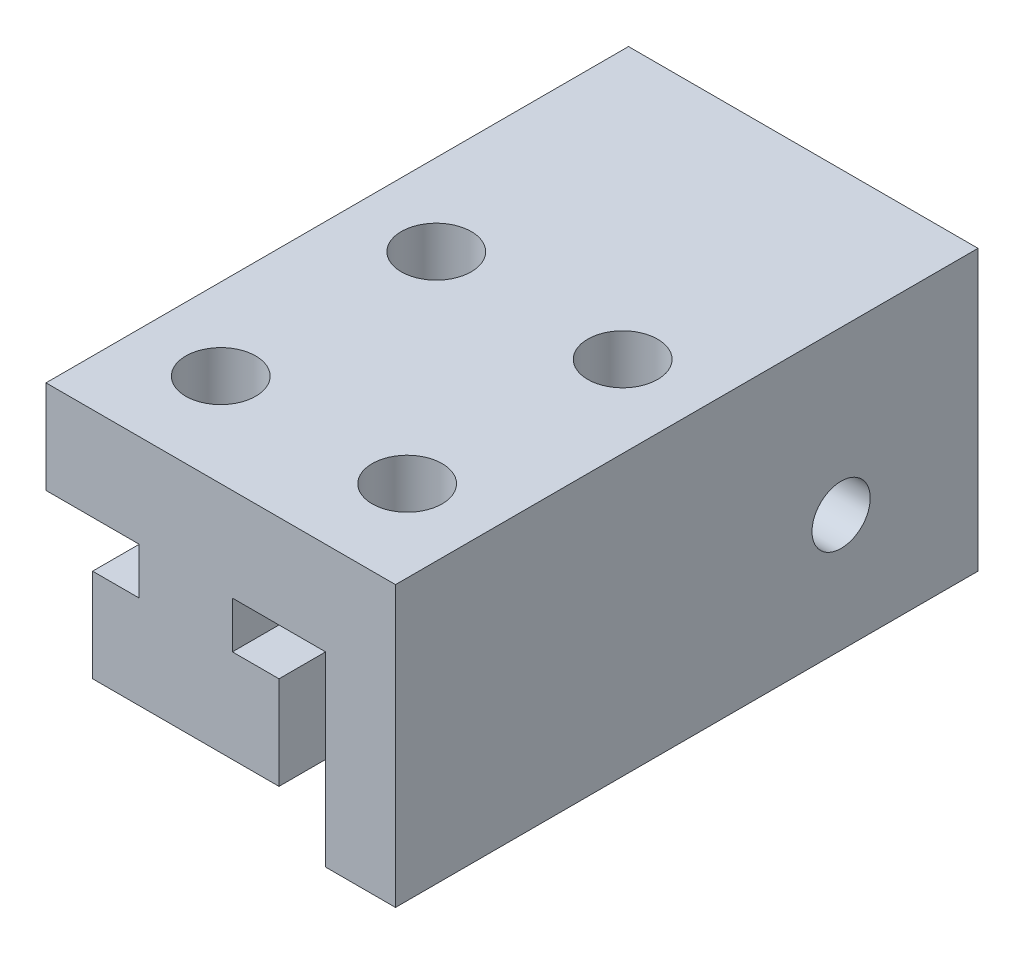
ISO-10303-21;
HEADER;
FILE_DESCRIPTION(('STEP AP214'),'2;1');
FILE_NAME('part.step','',(''),(''),'','','');
FILE_SCHEMA(('AUTOMOTIVE_DESIGN { 1 0 10303 214 1 1 1 1 }'));
ENDSEC;
DATA;
#1=APPLICATION_CONTEXT('core data for automotive mechanical design processes');
#2=APPLICATION_PROTOCOL_DEFINITION('international standard','automotive_design',2000,#1);
#3=PRODUCT_CONTEXT('',#1,'mechanical');
#4=PRODUCT('Part','Part','',(#3));
#5=PRODUCT_RELATED_PRODUCT_CATEGORY('part','',(#4));
#6=PRODUCT_DEFINITION_FORMATION('','',#4);
#7=PRODUCT_DEFINITION_CONTEXT('part definition',#1,'design');
#8=PRODUCT_DEFINITION('design','',#6,#7);
#9=PRODUCT_DEFINITION_SHAPE('','',#8);
#10=(LENGTH_UNIT() NAMED_UNIT(*) SI_UNIT(.MILLI.,.METRE.));
#11=(NAMED_UNIT(*) PLANE_ANGLE_UNIT() SI_UNIT($,.RADIAN.));
#12=(NAMED_UNIT(*) SI_UNIT($,.STERADIAN.) SOLID_ANGLE_UNIT());
#13=UNCERTAINTY_MEASURE_WITH_UNIT(LENGTH_MEASURE(1.E-05),#10,'distance_accuracy_value','');
#14=(GEOMETRIC_REPRESENTATION_CONTEXT(3) GLOBAL_UNCERTAINTY_ASSIGNED_CONTEXT((#13)) GLOBAL_UNIT_ASSIGNED_CONTEXT((#10,
#11,#12)) REPRESENTATION_CONTEXT('',''));
#15=CARTESIAN_POINT('',(0.,0.,0.));
#16=DIRECTION('',(0.,0.,1.));
#17=DIRECTION('',(1.,0.,0.));
#18=AXIS2_PLACEMENT_3D('',#15,#16,#17);
#19=CARTESIAN_POINT('',(17.7752792809798,6.06660807520635,-38.25));
#20=DIRECTION('',(1.,0.,0.));
#21=DIRECTION('',(0.,0.,-1.));
#22=AXIS2_PLACEMENT_3D('',#19,#20,#21);
#23=CYLINDRICAL_SURFACE('',#22,2.5);
#24=CARTESIAN_POINT('',(26.,6.06660807520635,-38.25));
#25=DIRECTION('',(-1.,0.,0.));
#26=DIRECTION('',(0.,0.,-1.));
#27=AXIS2_PLACEMENT_3D('',#24,#25,#26);
#28=CIRCLE('',#27,2.5);
#29=CARTESIAN_POINT('',(26.,6.06660807520635,-40.75));
#30=VERTEX_POINT('',#29);
#31=EDGE_CURVE('E253',#30,#30,#28,.T.);
#32=ORIENTED_EDGE('',*,*,#31,.F.);
#33=EDGE_LOOP('',(#32));
#34=FACE_BOUND('',#33,.T.);
#35=CARTESIAN_POINT('',(20.,6.06660807520635,-38.25));
#36=DIRECTION('',(1.,0.,0.));
#37=DIRECTION('',(0.,-1.,0.));
#38=AXIS2_PLACEMENT_3D('',#35,#36,#37);
#39=CIRCLE('',#38,2.5);
#40=CARTESIAN_POINT('',(20.,3.56660807520635,-38.25));
#41=VERTEX_POINT('',#40);
#42=EDGE_CURVE('E322',#41,#41,#39,.T.);
#43=ORIENTED_EDGE('',*,*,#42,.F.);
#44=EDGE_LOOP('',(#43));
#45=FACE_BOUND('',#44,.T.);
#46=ADVANCED_FACE('F41',(#34,#45),#23,.F.);
#47=CARTESIAN_POINT('',(19.,12.,-8.));
#48=DIRECTION('',(0.,-1.,0.));
#49=DIRECTION('',(0.,0.,-1.));
#50=AXIS2_PLACEMENT_3D('',#47,#48,#49);
#51=PLANE('',#50);
#52=DIRECTION('',(0.,0.,1.));
#53=VECTOR('',#52,1.);
#54=CARTESIAN_POINT('',(20.,12.,-40.));
#55=LINE('',#54,#53);
#56=CARTESIAN_POINT('',(20.,12.,-10.8284271247462));
#57=VERTEX_POINT('',#56);
#58=CARTESIAN_POINT('',(20.,12.,-5.17157287525381));
#59=VERTEX_POINT('',#58);
#60=EDGE_CURVE('E266',#57,#59,#55,.T.);
#61=ORIENTED_EDGE('',*,*,#60,.T.);
#62=CARTESIAN_POINT('',(19.,12.,-8.));
#63=DIRECTION('',(0.,-1.,0.));
#64=DIRECTION('',(0.,0.,1.));
#65=AXIS2_PLACEMENT_3D('',#62,#63,#64);
#66=CIRCLE('',#65,3.);
#67=EDGE_CURVE('E11',#57,#59,#66,.T.);
#68=ORIENTED_EDGE('',*,*,#67,.F.);
#69=EDGE_LOOP('',(#61,#68));
#70=FACE_BOUND('',#69,.T.);
#71=ADVANCED_FACE('F373',(#70),#51,.F.);
#72=CARTESIAN_POINT('',(19.,12.,-8.));
#73=DIRECTION('',(0.,1.,0.));
#74=DIRECTION('',(0.,0.,1.));
#75=AXIS2_PLACEMENT_3D('',#72,#73,#74);
#76=CYLINDRICAL_SURFACE('',#75,3.);
#77=ORIENTED_EDGE('',*,*,#67,.T.);
#78=CARTESIAN_POINT('',(19.,12.,-8.));
#79=DIRECTION('',(0.,-1.,0.));
#80=DIRECTION('',(0.,0.,1.));
#81=AXIS2_PLACEMENT_3D('',#78,#79,#80);
#82=CIRCLE('',#81,3.);
#83=EDGE_CURVE('E199',#59,#57,#82,.T.);
#84=ORIENTED_EDGE('',*,*,#83,.T.);
#85=EDGE_LOOP('',(#77,#84));
#86=FACE_BOUND('',#85,.T.);
#87=CARTESIAN_POINT('',(19.,20.,-8.));
#88=DIRECTION('',(0.,1.,0.));
#89=DIRECTION('',(0.,0.,1.));
#90=AXIS2_PLACEMENT_3D('',#87,#88,#89);
#91=CIRCLE('',#90,3.);
#92=CARTESIAN_POINT('',(19.,20.,-5.));
#93=VERTEX_POINT('',#92);
#94=EDGE_CURVE('E608',#93,#93,#91,.T.);
#95=ORIENTED_EDGE('',*,*,#94,.T.);
#96=EDGE_LOOP('',(#95));
#97=FACE_BOUND('',#96,.T.);
#98=ADVANCED_FACE('F380',(#86,#97),#76,.F.);
#99=CARTESIAN_POINT('',(19.,12.,-26.5));
#100=DIRECTION('',(0.,-1.,0.));
#101=DIRECTION('',(0.,0.,-1.));
#102=AXIS2_PLACEMENT_3D('',#99,#100,#101);
#103=PLANE('',#102);
#104=DIRECTION('',(0.,0.,1.));
#105=VECTOR('',#104,1.);
#106=CARTESIAN_POINT('',(20.,12.,-40.));
#107=LINE('',#106,#105);
#108=CARTESIAN_POINT('',(20.,12.,-29.3284271247462));
#109=VERTEX_POINT('',#108);
#110=CARTESIAN_POINT('',(20.,12.,-23.6715728752538));
#111=VERTEX_POINT('',#110);
#112=EDGE_CURVE('E259',#109,#111,#107,.T.);
#113=ORIENTED_EDGE('',*,*,#112,.T.);
#114=CARTESIAN_POINT('',(19.,12.,-26.5));
#115=DIRECTION('',(0.,-1.,0.));
#116=DIRECTION('',(0.,0.,-1.));
#117=AXIS2_PLACEMENT_3D('',#114,#115,#116);
#118=CIRCLE('',#117,3.);
#119=EDGE_CURVE('E48',#109,#111,#118,.T.);
#120=ORIENTED_EDGE('',*,*,#119,.F.);
#121=EDGE_LOOP('',(#113,#120));
#122=FACE_BOUND('',#121,.T.);
#123=ADVANCED_FACE('F408',(#122),#103,.F.);
#124=CARTESIAN_POINT('',(19.,12.,-26.5));
#125=DIRECTION('',(0.,1.,0.));
#126=DIRECTION('',(0.,0.,1.));
#127=AXIS2_PLACEMENT_3D('',#124,#125,#126);
#128=CYLINDRICAL_SURFACE('',#127,3.);
#129=ORIENTED_EDGE('',*,*,#119,.T.);
#130=CARTESIAN_POINT('',(19.,12.,-26.5));
#131=DIRECTION('',(0.,-1.,0.));
#132=DIRECTION('',(0.,0.,-1.));
#133=AXIS2_PLACEMENT_3D('',#130,#131,#132);
#134=CIRCLE('',#133,3.);
#135=EDGE_CURVE('E219',#111,#109,#134,.T.);
#136=ORIENTED_EDGE('',*,*,#135,.T.);
#137=EDGE_LOOP('',(#129,#136));
#138=FACE_BOUND('',#137,.T.);
#139=CARTESIAN_POINT('',(19.,20.,-26.5));
#140=DIRECTION('',(0.,1.,0.));
#141=DIRECTION('',(0.,0.,1.));
#142=AXIS2_PLACEMENT_3D('',#139,#140,#141);
#143=CIRCLE('',#142,3.);
#144=CARTESIAN_POINT('',(19.,20.,-23.5));
#145=VERTEX_POINT('',#144);
#146=EDGE_CURVE('E193',#145,#145,#143,.T.);
#147=ORIENTED_EDGE('',*,*,#146,.T.);
#148=EDGE_LOOP('',(#147));
#149=FACE_BOUND('',#148,.T.);
#150=ADVANCED_FACE('F494',(#138,#149),#128,.F.);
#151=CARTESIAN_POINT('',(3.,12.,-26.5));
#152=DIRECTION('',(0.,-1.,0.));
#153=DIRECTION('',(0.,0.,-1.));
#154=AXIS2_PLACEMENT_3D('',#151,#152,#153);
#155=PLANE('',#154);
#156=DIRECTION('',(0.,0.,1.));
#157=VECTOR('',#156,1.);
#158=CARTESIAN_POINT('',(4.,12.,0.));
#159=LINE('',#158,#157);
#160=CARTESIAN_POINT('',(4.,12.,-29.3284271247462));
#161=VERTEX_POINT('',#160);
#162=CARTESIAN_POINT('',(4.,12.,-23.6715728752538));
#163=VERTEX_POINT('',#162);
#164=EDGE_CURVE('E279',#161,#163,#159,.T.);
#165=ORIENTED_EDGE('',*,*,#164,.T.);
#166=CARTESIAN_POINT('',(3.,12.,-26.5));
#167=DIRECTION('',(0.,-1.,0.));
#168=DIRECTION('',(0.,0.,-1.));
#169=AXIS2_PLACEMENT_3D('',#166,#167,#168);
#170=CIRCLE('',#169,3.);
#171=EDGE_CURVE('E216',#161,#163,#170,.T.);
#172=ORIENTED_EDGE('',*,*,#171,.F.);
#173=EDGE_LOOP('',(#165,#172));
#174=FACE_BOUND('',#173,.T.);
#175=ADVANCED_FACE('F369',(#174),#155,.F.);
#176=CARTESIAN_POINT('',(3.,12.,-26.5));
#177=DIRECTION('',(0.,1.,0.));
#178=DIRECTION('',(0.,0.,1.));
#179=AXIS2_PLACEMENT_3D('',#176,#177,#178);
#180=CYLINDRICAL_SURFACE('',#179,3.);
#181=ORIENTED_EDGE('',*,*,#171,.T.);
#182=CARTESIAN_POINT('',(3.,12.,-26.5));
#183=DIRECTION('',(0.,-1.,0.));
#184=DIRECTION('',(0.,0.,-1.));
#185=AXIS2_PLACEMENT_3D('',#182,#183,#184);
#186=CIRCLE('',#185,3.);
#187=EDGE_CURVE('E337',#163,#161,#186,.T.);
#188=ORIENTED_EDGE('',*,*,#187,.T.);
#189=EDGE_LOOP('',(#181,#188));
#190=FACE_BOUND('',#189,.T.);
#191=CARTESIAN_POINT('',(3.,20.,-26.5));
#192=DIRECTION('',(0.,1.,0.));
#193=DIRECTION('',(0.,0.,1.));
#194=AXIS2_PLACEMENT_3D('',#191,#192,#193);
#195=CIRCLE('',#194,3.);
#196=CARTESIAN_POINT('',(3.,20.,-23.5));
#197=VERTEX_POINT('',#196);
#198=EDGE_CURVE('E190',#197,#197,#195,.T.);
#199=ORIENTED_EDGE('',*,*,#198,.T.);
#200=EDGE_LOOP('',(#199));
#201=FACE_BOUND('',#200,.T.);
#202=ADVANCED_FACE('F359',(#190,#201),#180,.F.);
#203=CARTESIAN_POINT('',(3.,12.,-8.));
#204=DIRECTION('',(0.,-1.,0.));
#205=DIRECTION('',(0.,0.,-1.));
#206=AXIS2_PLACEMENT_3D('',#203,#204,#205);
#207=PLANE('',#206);
#208=DIRECTION('',(0.,0.,1.));
#209=VECTOR('',#208,1.);
#210=CARTESIAN_POINT('',(4.,12.,0.));
#211=LINE('',#210,#209);
#212=CARTESIAN_POINT('',(4.,12.,-10.8284271247462));
#213=VERTEX_POINT('',#212);
#214=CARTESIAN_POINT('',(4.,12.,-5.17157287525381));
#215=VERTEX_POINT('',#214);
#216=EDGE_CURVE('E203',#213,#215,#211,.T.);
#217=ORIENTED_EDGE('',*,*,#216,.T.);
#218=CARTESIAN_POINT('',(3.,12.,-8.));
#219=DIRECTION('',(0.,-1.,0.));
#220=DIRECTION('',(0.,0.,-1.));
#221=AXIS2_PLACEMENT_3D('',#218,#219,#220);
#222=CIRCLE('',#221,3.);
#223=EDGE_CURVE('E218',#213,#215,#222,.T.);
#224=ORIENTED_EDGE('',*,*,#223,.F.);
#225=EDGE_LOOP('',(#217,#224));
#226=FACE_BOUND('',#225,.T.);
#227=ADVANCED_FACE('F357',(#226),#207,.F.);
#228=CARTESIAN_POINT('',(3.,12.,-8.));
#229=DIRECTION('',(0.,1.,0.));
#230=DIRECTION('',(0.,0.,1.));
#231=AXIS2_PLACEMENT_3D('',#228,#229,#230);
#232=CYLINDRICAL_SURFACE('',#231,3.);
#233=ORIENTED_EDGE('',*,*,#223,.T.);
#234=CARTESIAN_POINT('',(3.,12.,-8.));
#235=DIRECTION('',(0.,-1.,0.));
#236=DIRECTION('',(0.,0.,-1.));
#237=AXIS2_PLACEMENT_3D('',#234,#235,#236);
#238=CIRCLE('',#237,3.);
#239=EDGE_CURVE('E340',#215,#213,#238,.T.);
#240=ORIENTED_EDGE('',*,*,#239,.T.);
#241=EDGE_LOOP('',(#233,#240));
#242=FACE_BOUND('',#241,.T.);
#243=CARTESIAN_POINT('',(3.,20.,-8.));
#244=DIRECTION('',(0.,1.,0.));
#245=DIRECTION('',(0.,0.,1.));
#246=AXIS2_PLACEMENT_3D('',#243,#244,#245);
#247=CIRCLE('',#246,3.);
#248=CARTESIAN_POINT('',(3.,20.,-5.));
#249=VERTEX_POINT('',#248);
#250=EDGE_CURVE('E610',#249,#249,#247,.T.);
#251=ORIENTED_EDGE('',*,*,#250,.T.);
#252=EDGE_LOOP('',(#251));
#253=FACE_BOUND('',#252,.T.);
#254=ADVANCED_FACE('F344',(#242,#253),#232,.F.);
#255=CARTESIAN_POINT('',(-4.,0.,0.));
#256=DIRECTION('',(-1.,0.,0.));
#257=DIRECTION('',(0.,0.,1.));
#258=AXIS2_PLACEMENT_3D('',#255,#256,#257);
#259=PLANE('',#258);
#260=DIRECTION('',(0.,1.,0.));
#261=VECTOR('',#260,1.);
#262=CARTESIAN_POINT('',(-4.,16.,0.));
#263=LINE('',#262,#261);
#264=CARTESIAN_POINT('',(-4.,12.,0.));
#265=VERTEX_POINT('',#264);
#266=CARTESIAN_POINT('',(-4.,20.,0.));
#267=VERTEX_POINT('',#266);
#268=EDGE_CURVE('E174',#265,#267,#263,.T.);
#269=ORIENTED_EDGE('',*,*,#268,.T.);
#270=DIRECTION('',(0.,0.,1.));
#271=VECTOR('',#270,1.);
#272=CARTESIAN_POINT('',(-4.,20.,-50.));
#273=LINE('',#272,#271);
#274=CARTESIAN_POINT('',(-4.,20.,-50.));
#275=VERTEX_POINT('',#274);
#276=EDGE_CURVE('E177',#275,#267,#273,.T.);
#277=ORIENTED_EDGE('',*,*,#276,.F.);
#278=DIRECTION('',(0.,-1.,0.));
#279=VECTOR('',#278,1.);
#280=CARTESIAN_POINT('',(-4.,16.,-50.));
#281=LINE('',#280,#279);
#282=CARTESIAN_POINT('',(-4.,12.,-50.));
#283=VERTEX_POINT('',#282);
#284=EDGE_CURVE('E167',#275,#283,#281,.T.);
#285=ORIENTED_EDGE('',*,*,#284,.T.);
#286=DIRECTION('',(0.,0.,1.));
#287=VECTOR('',#286,1.);
#288=CARTESIAN_POINT('',(-4.,12.,0.));
#289=LINE('',#288,#287);
#290=EDGE_CURVE('E55',#283,#265,#289,.T.);
#291=ORIENTED_EDGE('',*,*,#290,.T.);
#292=EDGE_LOOP('',(#269,#277,#285,#291));
#293=FACE_BOUND('',#292,.T.);
#294=ADVANCED_FACE('F178',(#293),#259,.T.);
#295=CARTESIAN_POINT('',(-4.,12.,0.));
#296=DIRECTION('',(0.,1.,0.));
#297=DIRECTION('',(0.,0.,-1.));
#298=AXIS2_PLACEMENT_3D('',#295,#296,#297);
#299=PLANE('',#298);
#300=ORIENTED_EDGE('',*,*,#187,.F.);
#301=DIRECTION('',(0.,0.,1.));
#302=VECTOR('',#301,1.);
#303=CARTESIAN_POINT('',(4.,12.,0.));
#304=LINE('',#303,#302);
#305=EDGE_CURVE('E232',#163,#213,#304,.T.);
#306=ORIENTED_EDGE('',*,*,#305,.T.);
#307=ORIENTED_EDGE('',*,*,#239,.F.);
#308=DIRECTION('',(0.,0.,1.));
#309=VECTOR('',#308,1.);
#310=CARTESIAN_POINT('',(4.,12.,0.));
#311=LINE('',#310,#309);
#312=CARTESIAN_POINT('',(4.,12.,0.));
#313=VERTEX_POINT('',#312);
#314=EDGE_CURVE('E200',#215,#313,#311,.T.);
#315=ORIENTED_EDGE('',*,*,#314,.T.);
#316=DIRECTION('',(1.,0.,0.));
#317=VECTOR('',#316,1.);
#318=CARTESIAN_POINT('',(-4.,12.,0.));
#319=LINE('',#318,#317);
#320=EDGE_CURVE('E335',#265,#313,#319,.T.);
#321=ORIENTED_EDGE('',*,*,#320,.F.);
#322=ORIENTED_EDGE('',*,*,#290,.F.);
#323=DIRECTION('',(1.,0.,0.));
#324=VECTOR('',#323,1.);
#325=CARTESIAN_POINT('',(-4.,12.,-50.));
#326=LINE('',#325,#324);
#327=CARTESIAN_POINT('',(4.,12.,-50.));
#328=VERTEX_POINT('',#327);
#329=EDGE_CURVE('E173',#283,#328,#326,.T.);
#330=ORIENTED_EDGE('',*,*,#329,.T.);
#331=DIRECTION('',(0.,0.,1.));
#332=VECTOR('',#331,1.);
#333=CARTESIAN_POINT('',(4.,12.,0.));
#334=LINE('',#333,#332);
#335=EDGE_CURVE('E252',#328,#161,#334,.T.);
#336=ORIENTED_EDGE('',*,*,#335,.T.);
#337=EDGE_LOOP('',(#300,#306,#307,#315,#321,#322,#330,#336));
#338=FACE_BOUND('',#337,.T.);
#339=ADVANCED_FACE('F349',(#338),#299,.F.);
#340=CARTESIAN_POINT('',(0.,0.,0.));
#341=DIRECTION('',(0.,0.,1.));
#342=DIRECTION('',(1.,0.,0.));
#343=AXIS2_PLACEMENT_3D('',#340,#341,#342);
#344=PLANE('',#343);
#345=DIRECTION('',(0.,1.,0.));
#346=VECTOR('',#345,1.);
#347=CARTESIAN_POINT('',(26.,-4.,0.));
#348=LINE('',#347,#346);
#349=CARTESIAN_POINT('',(26.,-4.,0.));
#350=VERTEX_POINT('',#349);
#351=CARTESIAN_POINT('',(26.,20.,0.));
#352=VERTEX_POINT('',#351);
#353=EDGE_CURVE('E255',#350,#352,#348,.T.);
#354=ORIENTED_EDGE('',*,*,#353,.T.);
#355=DIRECTION('',(1.,0.,0.));
#356=VECTOR('',#355,1.);
#357=CARTESIAN_POINT('',(-4.,20.,0.));
#358=LINE('',#357,#356);
#359=EDGE_CURVE('E183',#267,#352,#358,.T.);
#360=ORIENTED_EDGE('',*,*,#359,.F.);
#361=ORIENTED_EDGE('',*,*,#268,.F.);
#362=ORIENTED_EDGE('',*,*,#320,.T.);
#363=DIRECTION('',(0.,-1.,0.));
#364=VECTOR('',#363,1.);
#365=CARTESIAN_POINT('',(4.,16.,0.));
#366=LINE('',#365,#364);
#367=CARTESIAN_POINT('',(4.,8.,0.));
#368=VERTEX_POINT('',#367);
#369=EDGE_CURVE('E204',#313,#368,#366,.T.);
#370=ORIENTED_EDGE('',*,*,#369,.T.);
#371=DIRECTION('',(-1.,0.,0.));
#372=VECTOR('',#371,1.);
#373=CARTESIAN_POINT('',(4.,8.,0.));
#374=LINE('',#373,#372);
#375=CARTESIAN_POINT('',(0.,8.,0.));
#376=VERTEX_POINT('',#375);
#377=EDGE_CURVE('E282',#368,#376,#374,.T.);
#378=ORIENTED_EDGE('',*,*,#377,.T.);
#379=DIRECTION('',(0.,-1.,0.));
#380=VECTOR('',#379,1.);
#381=CARTESIAN_POINT('',(0.,8.,0.));
#382=LINE('',#381,#380);
#383=CARTESIAN_POINT('',(0.,0.,0.));
#384=VERTEX_POINT('',#383);
#385=EDGE_CURVE('E249',#376,#384,#382,.T.);
#386=ORIENTED_EDGE('',*,*,#385,.T.);
#387=DIRECTION('',(1.,0.,0.));
#388=VECTOR('',#387,1.);
#389=CARTESIAN_POINT('',(0.,0.,0.));
#390=LINE('',#389,#388);
#391=CARTESIAN_POINT('',(16.,0.,0.));
#392=VERTEX_POINT('',#391);
#393=EDGE_CURVE('E229',#384,#392,#390,.T.);
#394=ORIENTED_EDGE('',*,*,#393,.T.);
#395=DIRECTION('',(0.,1.,0.));
#396=VECTOR('',#395,1.);
#397=CARTESIAN_POINT('',(16.,0.,0.));
#398=LINE('',#397,#396);
#399=CARTESIAN_POINT('',(16.,8.,0.));
#400=VERTEX_POINT('',#399);
#401=EDGE_CURVE('E211',#392,#400,#398,.T.);
#402=ORIENTED_EDGE('',*,*,#401,.T.);
#403=DIRECTION('',(-1.,0.,0.));
#404=VECTOR('',#403,1.);
#405=CARTESIAN_POINT('',(16.,8.,0.));
#406=LINE('',#405,#404);
#407=CARTESIAN_POINT('',(12.,8.,0.));
#408=VERTEX_POINT('',#407);
#409=EDGE_CURVE('E308',#400,#408,#406,.T.);
#410=ORIENTED_EDGE('',*,*,#409,.T.);
#411=DIRECTION('',(0.,1.,0.));
#412=VECTOR('',#411,1.);
#413=CARTESIAN_POINT('',(12.,8.,0.));
#414=LINE('',#413,#412);
#415=CARTESIAN_POINT('',(12.,12.,0.));
#416=VERTEX_POINT('',#415);
#417=EDGE_CURVE('E317',#408,#416,#414,.T.);
#418=ORIENTED_EDGE('',*,*,#417,.T.);
#419=DIRECTION('',(1.,0.,0.));
#420=VECTOR('',#419,1.);
#421=CARTESIAN_POINT('',(12.,12.,0.));
#422=LINE('',#421,#420);
#423=CARTESIAN_POINT('',(20.,12.,0.));
#424=VERTEX_POINT('',#423);
#425=EDGE_CURVE('E215',#416,#424,#422,.T.);
#426=ORIENTED_EDGE('',*,*,#425,.T.);
#427=DIRECTION('',(0.,-1.,0.));
#428=VECTOR('',#427,1.);
#429=CARTESIAN_POINT('',(20.,12.,0.));
#430=LINE('',#429,#428);
#431=CARTESIAN_POINT('',(20.,-4.,0.));
#432=VERTEX_POINT('',#431);
#433=EDGE_CURVE('E302',#424,#432,#430,.T.);
#434=ORIENTED_EDGE('',*,*,#433,.T.);
#435=DIRECTION('',(1.,0.,0.));
#436=VECTOR('',#435,1.);
#437=CARTESIAN_POINT('',(20.,-4.,0.));
#438=LINE('',#437,#436);
#439=EDGE_CURVE('E239',#432,#350,#438,.T.);
#440=ORIENTED_EDGE('',*,*,#439,.T.);
#441=EDGE_LOOP('',(#354,#360,#361,#362,#370,#378,#386,#394,#402,#410,#418,#426,#434,#440));
#442=FACE_BOUND('',#441,.T.);
#443=ADVANCED_FACE('F419',(#442),#344,.T.);
#444=CARTESIAN_POINT('',(0.,0.,-50.));
#445=DIRECTION('',(0.,0.,1.));
#446=DIRECTION('',(1.,0.,0.));
#447=AXIS2_PLACEMENT_3D('',#444,#445,#446);
#448=PLANE('',#447);
#449=ORIENTED_EDGE('',*,*,#284,.F.);
#450=DIRECTION('',(-1.,0.,0.));
#451=VECTOR('',#450,1.);
#452=CARTESIAN_POINT('',(26.,20.,-50.));
#453=LINE('',#452,#451);
#454=CARTESIAN_POINT('',(26.,20.,-50.));
#455=VERTEX_POINT('',#454);
#456=EDGE_CURVE('E171',#455,#275,#453,.T.);
#457=ORIENTED_EDGE('',*,*,#456,.F.);
#458=DIRECTION('',(0.,1.,0.));
#459=VECTOR('',#458,1.);
#460=CARTESIAN_POINT('',(26.,-4.,-50.));
#461=LINE('',#460,#459);
#462=CARTESIAN_POINT('',(26.,-4.,-50.));
#463=VERTEX_POINT('',#462);
#464=EDGE_CURVE('E331',#463,#455,#461,.T.);
#465=ORIENTED_EDGE('',*,*,#464,.F.);
#466=DIRECTION('',(1.,0.,0.));
#467=VECTOR('',#466,1.);
#468=CARTESIAN_POINT('',(20.,-4.,-50.));
#469=LINE('',#468,#467);
#470=CARTESIAN_POINT('',(20.,-4.,-50.));
#471=VERTEX_POINT('',#470);
#472=EDGE_CURVE('E263',#471,#463,#469,.T.);
#473=ORIENTED_EDGE('',*,*,#472,.F.);
#474=DIRECTION('',(0.,-1.,0.));
#475=VECTOR('',#474,1.);
#476=CARTESIAN_POINT('',(20.,12.,-50.));
#477=LINE('',#476,#475);
#478=CARTESIAN_POINT('',(20.,12.,-50.));
#479=VERTEX_POINT('',#478);
#480=EDGE_CURVE('E240',#479,#471,#477,.T.);
#481=ORIENTED_EDGE('',*,*,#480,.F.);
#482=DIRECTION('',(1.,0.,0.));
#483=VECTOR('',#482,1.);
#484=CARTESIAN_POINT('',(12.,12.,-50.));
#485=LINE('',#484,#483);
#486=CARTESIAN_POINT('',(12.,12.,-50.));
#487=VERTEX_POINT('',#486);
#488=EDGE_CURVE('E226',#487,#479,#485,.T.);
#489=ORIENTED_EDGE('',*,*,#488,.F.);
#490=DIRECTION('',(0.,1.,0.));
#491=VECTOR('',#490,1.);
#492=CARTESIAN_POINT('',(12.,8.,-50.));
#493=LINE('',#492,#491);
#494=CARTESIAN_POINT('',(12.,8.,-50.));
#495=VERTEX_POINT('',#494);
#496=EDGE_CURVE('E320',#495,#487,#493,.T.);
#497=ORIENTED_EDGE('',*,*,#496,.F.);
#498=DIRECTION('',(-1.,0.,0.));
#499=VECTOR('',#498,1.);
#500=CARTESIAN_POINT('',(16.,8.,-50.));
#501=LINE('',#500,#499);
#502=CARTESIAN_POINT('',(16.,8.,-50.));
#503=VERTEX_POINT('',#502);
#504=EDGE_CURVE('E311',#503,#495,#501,.T.);
#505=ORIENTED_EDGE('',*,*,#504,.F.);
#506=DIRECTION('',(0.,1.,0.));
#507=VECTOR('',#506,1.);
#508=CARTESIAN_POINT('',(16.,0.,-50.));
#509=LINE('',#508,#507);
#510=CARTESIAN_POINT('',(16.,0.,-50.));
#511=VERTEX_POINT('',#510);
#512=EDGE_CURVE('E299',#511,#503,#509,.T.);
#513=ORIENTED_EDGE('',*,*,#512,.F.);
#514=DIRECTION('',(1.,0.,0.));
#515=VECTOR('',#514,1.);
#516=CARTESIAN_POINT('',(0.,0.,-50.));
#517=LINE('',#516,#515);
#518=CARTESIAN_POINT('',(0.,0.,-50.));
#519=VERTEX_POINT('',#518);
#520=EDGE_CURVE('E212',#519,#511,#517,.T.);
#521=ORIENTED_EDGE('',*,*,#520,.F.);
#522=DIRECTION('',(0.,-1.,0.));
#523=VECTOR('',#522,1.);
#524=CARTESIAN_POINT('',(0.,8.,-50.));
#525=LINE('',#524,#523);
#526=CARTESIAN_POINT('',(0.,8.,-50.));
#527=VERTEX_POINT('',#526);
#528=EDGE_CURVE('E245',#527,#519,#525,.T.);
#529=ORIENTED_EDGE('',*,*,#528,.F.);
#530=DIRECTION('',(-1.,0.,0.));
#531=VECTOR('',#530,1.);
#532=CARTESIAN_POINT('',(4.,8.,-50.));
#533=LINE('',#532,#531);
#534=CARTESIAN_POINT('',(4.,8.,-50.));
#535=VERTEX_POINT('',#534);
#536=EDGE_CURVE('E285',#535,#527,#533,.T.);
#537=ORIENTED_EDGE('',*,*,#536,.F.);
#538=DIRECTION('',(0.,-1.,0.));
#539=VECTOR('',#538,1.);
#540=CARTESIAN_POINT('',(4.,16.,-50.));
#541=LINE('',#540,#539);
#542=EDGE_CURVE('E269',#328,#535,#541,.T.);
#543=ORIENTED_EDGE('',*,*,#542,.F.);
#544=ORIENTED_EDGE('',*,*,#329,.F.);
#545=EDGE_LOOP('',(#449,#457,#465,#473,#481,#489,#497,#505,#513,#521,#529,#537,#543,#544));
#546=FACE_BOUND('',#545,.T.);
#547=ADVANCED_FACE('F169',(#546),#448,.F.);
#548=CARTESIAN_POINT('',(26.,-4.,-40.));
#549=DIRECTION('',(1.,0.,0.));
#550=DIRECTION('',(0.,1.,0.));
#551=AXIS2_PLACEMENT_3D('',#548,#549,#550);
#552=PLANE('',#551);
#553=ORIENTED_EDGE('',*,*,#353,.F.);
#554=DIRECTION('',(0.,0.,1.));
#555=VECTOR('',#554,1.);
#556=CARTESIAN_POINT('',(26.,-4.,-40.));
#557=LINE('',#556,#555);
#558=EDGE_CURVE('E256',#463,#350,#557,.T.);
#559=ORIENTED_EDGE('',*,*,#558,.F.);
#560=ORIENTED_EDGE('',*,*,#464,.T.);
#561=DIRECTION('',(0.,0.,-1.));
#562=VECTOR('',#561,1.);
#563=CARTESIAN_POINT('',(26.,20.,0.));
#564=LINE('',#563,#562);
#565=EDGE_CURVE('E189',#352,#455,#564,.T.);
#566=ORIENTED_EDGE('',*,*,#565,.F.);
#567=EDGE_LOOP('',(#553,#559,#560,#566));
#568=FACE_BOUND('',#567,.T.);
#569=ORIENTED_EDGE('',*,*,#31,.T.);
#570=EDGE_LOOP('',(#569));
#571=FACE_BOUND('',#570,.T.);
#572=ADVANCED_FACE('F403',(#568,#571),#552,.T.);
#573=CARTESIAN_POINT('',(20.,-4.,-40.));
#574=DIRECTION('',(0.,-1.,0.));
#575=DIRECTION('',(0.,0.,-1.));
#576=AXIS2_PLACEMENT_3D('',#573,#574,#575);
#577=PLANE('',#576);
#578=ORIENTED_EDGE('',*,*,#439,.F.);
#579=DIRECTION('',(0.,0.,1.));
#580=VECTOR('',#579,1.);
#581=CARTESIAN_POINT('',(20.,-4.,-40.));
#582=LINE('',#581,#580);
#583=EDGE_CURVE('E236',#471,#432,#582,.T.);
#584=ORIENTED_EDGE('',*,*,#583,.F.);
#585=ORIENTED_EDGE('',*,*,#472,.T.);
#586=ORIENTED_EDGE('',*,*,#558,.T.);
#587=EDGE_LOOP('',(#578,#584,#585,#586));
#588=FACE_BOUND('',#587,.T.);
#589=ADVANCED_FACE('F390',(#588),#577,.T.);
#590=CARTESIAN_POINT('',(20.,12.,-40.));
#591=DIRECTION('',(-1.,0.,0.));
#592=DIRECTION('',(0.,1.,0.));
#593=AXIS2_PLACEMENT_3D('',#590,#591,#592);
#594=PLANE('',#593);
#595=ORIENTED_EDGE('',*,*,#433,.F.);
#596=DIRECTION('',(0.,0.,1.));
#597=VECTOR('',#596,1.);
#598=CARTESIAN_POINT('',(20.,12.,-40.));
#599=LINE('',#598,#597);
#600=EDGE_CURVE('E207',#59,#424,#599,.T.);
#601=ORIENTED_EDGE('',*,*,#600,.F.);
#602=ORIENTED_EDGE('',*,*,#60,.F.);
#603=DIRECTION('',(0.,0.,1.));
#604=VECTOR('',#603,1.);
#605=CARTESIAN_POINT('',(20.,12.,-40.));
#606=LINE('',#605,#604);
#607=EDGE_CURVE('E222',#111,#57,#606,.T.);
#608=ORIENTED_EDGE('',*,*,#607,.F.);
#609=ORIENTED_EDGE('',*,*,#112,.F.);
#610=DIRECTION('',(0.,0.,1.));
#611=VECTOR('',#610,1.);
#612=CARTESIAN_POINT('',(20.,12.,-40.));
#613=LINE('',#612,#611);
#614=EDGE_CURVE('E223',#479,#109,#613,.T.);
#615=ORIENTED_EDGE('',*,*,#614,.F.);
#616=ORIENTED_EDGE('',*,*,#480,.T.);
#617=ORIENTED_EDGE('',*,*,#583,.T.);
#618=EDGE_LOOP('',(#595,#601,#602,#608,#609,#615,#616,#617));
#619=FACE_BOUND('',#618,.T.);
#620=ORIENTED_EDGE('',*,*,#42,.T.);
#621=EDGE_LOOP('',(#620));
#622=FACE_BOUND('',#621,.T.);
#623=ADVANCED_FACE('F387',(#619,#622),#594,.T.);
#624=CARTESIAN_POINT('',(12.,8.,-40.));
#625=DIRECTION('',(1.,0.,0.));
#626=DIRECTION('',(0.,1.,0.));
#627=AXIS2_PLACEMENT_3D('',#624,#625,#626);
#628=PLANE('',#627);
#629=ORIENTED_EDGE('',*,*,#417,.F.);
#630=DIRECTION('',(0.,0.,1.));
#631=VECTOR('',#630,1.);
#632=CARTESIAN_POINT('',(12.,8.,-40.));
#633=LINE('',#632,#631);
#634=EDGE_CURVE('E314',#495,#408,#633,.T.);
#635=ORIENTED_EDGE('',*,*,#634,.F.);
#636=ORIENTED_EDGE('',*,*,#496,.T.);
#637=DIRECTION('',(0.,0.,1.));
#638=VECTOR('',#637,1.);
#639=CARTESIAN_POINT('',(12.,12.,-40.));
#640=LINE('',#639,#638);
#641=EDGE_CURVE('E235',#487,#416,#640,.T.);
#642=ORIENTED_EDGE('',*,*,#641,.T.);
#643=EDGE_LOOP('',(#629,#635,#636,#642));
#644=FACE_BOUND('',#643,.T.);
#645=ADVANCED_FACE('F389',(#644),#628,.T.);
#646=CARTESIAN_POINT('',(16.,8.,-40.));
#647=DIRECTION('',(0.,1.,0.));
#648=DIRECTION('',(1.,0.,0.));
#649=AXIS2_PLACEMENT_3D('',#646,#647,#648);
#650=PLANE('',#649);
#651=ORIENTED_EDGE('',*,*,#409,.F.);
#652=DIRECTION('',(0.,0.,1.));
#653=VECTOR('',#652,1.);
#654=CARTESIAN_POINT('',(16.,8.,-40.));
#655=LINE('',#654,#653);
#656=EDGE_CURVE('E305',#503,#400,#655,.T.);
#657=ORIENTED_EDGE('',*,*,#656,.F.);
#658=ORIENTED_EDGE('',*,*,#504,.T.);
#659=ORIENTED_EDGE('',*,*,#634,.T.);
#660=EDGE_LOOP('',(#651,#657,#658,#659));
#661=FACE_BOUND('',#660,.T.);
#662=ADVANCED_FACE('F399',(#661),#650,.T.);
#663=CARTESIAN_POINT('',(16.,0.,-40.));
#664=DIRECTION('',(1.,0.,0.));
#665=DIRECTION('',(0.,1.,0.));
#666=AXIS2_PLACEMENT_3D('',#663,#664,#665);
#667=PLANE('',#666);
#668=ORIENTED_EDGE('',*,*,#401,.F.);
#669=DIRECTION('',(0.,0.,1.));
#670=VECTOR('',#669,1.);
#671=CARTESIAN_POINT('',(16.,0.,-40.));
#672=LINE('',#671,#670);
#673=EDGE_CURVE('E208',#511,#392,#672,.T.);
#674=ORIENTED_EDGE('',*,*,#673,.F.);
#675=ORIENTED_EDGE('',*,*,#512,.T.);
#676=ORIENTED_EDGE('',*,*,#656,.T.);
#677=EDGE_LOOP('',(#668,#674,#675,#676));
#678=FACE_BOUND('',#677,.T.);
#679=ADVANCED_FACE('F413',(#678),#667,.T.);
#680=CARTESIAN_POINT('',(0.,0.,-40.));
#681=DIRECTION('',(0.,-1.,0.));
#682=DIRECTION('',(0.,0.,-1.));
#683=AXIS2_PLACEMENT_3D('',#680,#681,#682);
#684=PLANE('',#683);
#685=ORIENTED_EDGE('',*,*,#393,.F.);
#686=DIRECTION('',(0.,0.,1.));
#687=VECTOR('',#686,1.);
#688=CARTESIAN_POINT('',(0.,0.,-40.));
#689=LINE('',#688,#687);
#690=EDGE_CURVE('E248',#519,#384,#689,.T.);
#691=ORIENTED_EDGE('',*,*,#690,.F.);
#692=ORIENTED_EDGE('',*,*,#520,.T.);
#693=ORIENTED_EDGE('',*,*,#673,.T.);
#694=EDGE_LOOP('',(#685,#691,#692,#693));
#695=FACE_BOUND('',#694,.T.);
#696=ADVANCED_FACE('F410',(#695),#684,.T.);
#697=CARTESIAN_POINT('',(0.,8.,-40.));
#698=DIRECTION('',(-1.,0.,0.));
#699=DIRECTION('',(0.,0.,1.));
#700=AXIS2_PLACEMENT_3D('',#697,#698,#699);
#701=PLANE('',#700);
#702=ORIENTED_EDGE('',*,*,#385,.F.);
#703=DIRECTION('',(0.,0.,1.));
#704=VECTOR('',#703,1.);
#705=CARTESIAN_POINT('',(0.,8.,-40.));
#706=LINE('',#705,#704);
#707=EDGE_CURVE('E288',#527,#376,#706,.T.);
#708=ORIENTED_EDGE('',*,*,#707,.F.);
#709=ORIENTED_EDGE('',*,*,#528,.T.);
#710=ORIENTED_EDGE('',*,*,#690,.T.);
#711=EDGE_LOOP('',(#702,#708,#709,#710));
#712=FACE_BOUND('',#711,.T.);
#713=ADVANCED_FACE('F412',(#712),#701,.T.);
#714=CARTESIAN_POINT('',(4.,8.,-40.));
#715=DIRECTION('',(0.,1.,0.));
#716=DIRECTION('',(1.,0.,0.));
#717=AXIS2_PLACEMENT_3D('',#714,#715,#716);
#718=PLANE('',#717);
#719=ORIENTED_EDGE('',*,*,#377,.F.);
#720=DIRECTION('',(0.,0.,1.));
#721=VECTOR('',#720,1.);
#722=CARTESIAN_POINT('',(4.,8.,-40.));
#723=LINE('',#722,#721);
#724=EDGE_CURVE('E272',#535,#368,#723,.T.);
#725=ORIENTED_EDGE('',*,*,#724,.F.);
#726=ORIENTED_EDGE('',*,*,#536,.T.);
#727=ORIENTED_EDGE('',*,*,#707,.T.);
#728=EDGE_LOOP('',(#719,#725,#726,#727));
#729=FACE_BOUND('',#728,.T.);
#730=ADVANCED_FACE('F533',(#729),#718,.T.);
#731=CARTESIAN_POINT('',(4.,16.,-40.));
#732=DIRECTION('',(-1.,0.,0.));
#733=DIRECTION('',(0.,0.,1.));
#734=AXIS2_PLACEMENT_3D('',#731,#732,#733);
#735=PLANE('',#734);
#736=ORIENTED_EDGE('',*,*,#335,.F.);
#737=ORIENTED_EDGE('',*,*,#542,.T.);
#738=ORIENTED_EDGE('',*,*,#724,.T.);
#739=ORIENTED_EDGE('',*,*,#369,.F.);
#740=ORIENTED_EDGE('',*,*,#314,.F.);
#741=ORIENTED_EDGE('',*,*,#216,.F.);
#742=ORIENTED_EDGE('',*,*,#305,.F.);
#743=ORIENTED_EDGE('',*,*,#164,.F.);
#744=EDGE_LOOP('',(#736,#737,#738,#739,#740,#741,#742,#743));
#745=FACE_BOUND('',#744,.T.);
#746=ADVANCED_FACE('F354',(#745),#735,.T.);
#747=CARTESIAN_POINT('',(12.,12.,-40.));
#748=DIRECTION('',(0.,-1.,0.));
#749=DIRECTION('',(-1.,0.,0.));
#750=AXIS2_PLACEMENT_3D('',#747,#748,#749);
#751=PLANE('',#750);
#752=ORIENTED_EDGE('',*,*,#83,.F.);
#753=ORIENTED_EDGE('',*,*,#600,.T.);
#754=ORIENTED_EDGE('',*,*,#425,.F.);
#755=ORIENTED_EDGE('',*,*,#641,.F.);
#756=ORIENTED_EDGE('',*,*,#488,.T.);
#757=ORIENTED_EDGE('',*,*,#614,.T.);
#758=ORIENTED_EDGE('',*,*,#135,.F.);
#759=ORIENTED_EDGE('',*,*,#607,.T.);
#760=EDGE_LOOP('',(#752,#753,#754,#755,#756,#757,#758,#759));
#761=FACE_BOUND('',#760,.T.);
#762=ADVANCED_FACE('F454',(#761),#751,.T.);
#763=CARTESIAN_POINT('',(0.,20.,0.));
#764=DIRECTION('',(0.,1.,0.));
#765=DIRECTION('',(0.,0.,1.));
#766=AXIS2_PLACEMENT_3D('',#763,#764,#765);
#767=PLANE('',#766);
#768=ORIENTED_EDGE('',*,*,#250,.F.);
#769=EDGE_LOOP('',(#768));
#770=FACE_BOUND('',#769,.T.);
#771=ORIENTED_EDGE('',*,*,#198,.F.);
#772=EDGE_LOOP('',(#771));
#773=FACE_BOUND('',#772,.T.);
#774=ORIENTED_EDGE('',*,*,#456,.T.);
#775=ORIENTED_EDGE('',*,*,#276,.T.);
#776=ORIENTED_EDGE('',*,*,#359,.T.);
#777=ORIENTED_EDGE('',*,*,#565,.T.);
#778=EDGE_LOOP('',(#774,#775,#776,#777));
#779=FACE_BOUND('',#778,.T.);
#780=ORIENTED_EDGE('',*,*,#146,.F.);
#781=EDGE_LOOP('',(#780));
#782=FACE_BOUND('',#781,.T.);
#783=ORIENTED_EDGE('',*,*,#94,.F.);
#784=EDGE_LOOP('',(#783));
#785=FACE_BOUND('',#784,.T.);
#786=ADVANCED_FACE('F186',(#770,#773,#779,#782,#785),#767,.T.);
#787=CLOSED_SHELL('',(#46,#71,#98,#123,#150,#175,#202,#227,#254,#294,#339,#443,#547,#572,#589,
#623,#645,#662,#679,#696,#713,#730,#746,#762,#786));
#788=MANIFOLD_SOLID_BREP('B2',#787);
#789=ADVANCED_BREP_SHAPE_REPRESENTATION('',(#18,#788),#14);
#790=SHAPE_DEFINITION_REPRESENTATION(#9,#789);
ENDSEC;
END-ISO-10303-21;
